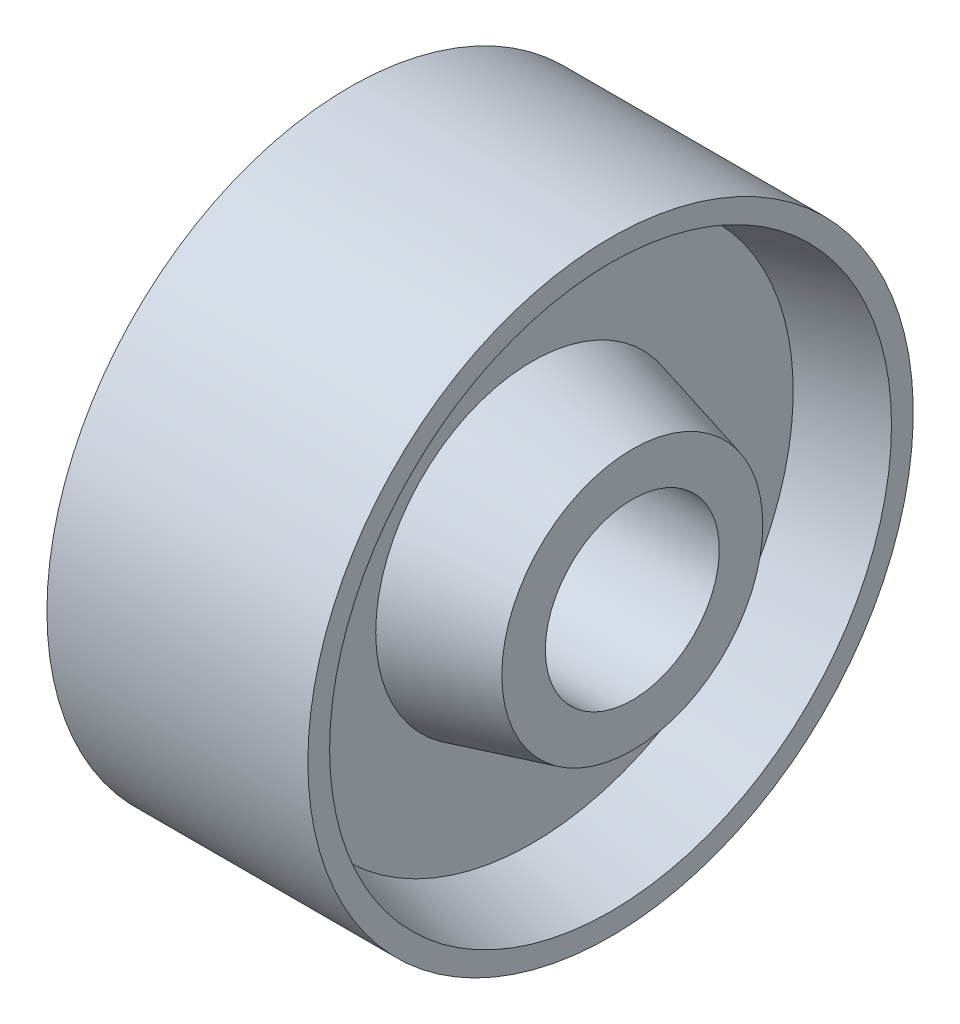
ISO-10303-21;
HEADER;
FILE_DESCRIPTION(('STEP AP214'),'2;1');
FILE_NAME('part.step','',(''),(''),'','','');
FILE_SCHEMA(('AUTOMOTIVE_DESIGN { 1 0 10303 214 1 1 1 1 }'));
ENDSEC;
DATA;
#1=APPLICATION_CONTEXT('core data for automotive mechanical design processes');
#2=APPLICATION_PROTOCOL_DEFINITION('international standard','automotive_design',2000,#1);
#3=PRODUCT_CONTEXT('',#1,'mechanical');
#4=PRODUCT('Part','Part','',(#3));
#5=PRODUCT_RELATED_PRODUCT_CATEGORY('part','',(#4));
#6=PRODUCT_DEFINITION_FORMATION('','',#4);
#7=PRODUCT_DEFINITION_CONTEXT('part definition',#1,'design');
#8=PRODUCT_DEFINITION('design','',#6,#7);
#9=PRODUCT_DEFINITION_SHAPE('','',#8);
#10=(LENGTH_UNIT() NAMED_UNIT(*) SI_UNIT(.MILLI.,.METRE.));
#11=(NAMED_UNIT(*) PLANE_ANGLE_UNIT() SI_UNIT($,.RADIAN.));
#12=(NAMED_UNIT(*) SI_UNIT($,.STERADIAN.) SOLID_ANGLE_UNIT());
#13=UNCERTAINTY_MEASURE_WITH_UNIT(LENGTH_MEASURE(1.E-05),#10,'distance_accuracy_value','');
#14=(GEOMETRIC_REPRESENTATION_CONTEXT(3) GLOBAL_UNCERTAINTY_ASSIGNED_CONTEXT((#13)) GLOBAL_UNIT_ASSIGNED_CONTEXT((#10,
#11,#12)) REPRESENTATION_CONTEXT('',''));
#15=CARTESIAN_POINT('',(0.,0.,0.));
#16=DIRECTION('',(0.,0.,1.));
#17=DIRECTION('',(1.,0.,0.));
#18=AXIS2_PLACEMENT_3D('',#15,#16,#17);
#19=CARTESIAN_POINT('',(-22.225,19.05,0.));
#20=DIRECTION('',(1.,0.,0.));
#21=DIRECTION('',(0.,0.,-1.));
#22=AXIS2_PLACEMENT_3D('',#19,#20,#21);
#23=PLANE('',#22);
#24=CARTESIAN_POINT('',(-22.225,0.,0.));
#25=DIRECTION('',(-1.,0.,0.));
#26=DIRECTION('',(0.,0.,1.));
#27=AXIS2_PLACEMENT_3D('',#24,#25,#26);
#28=CIRCLE('',#27,12.7);
#29=CARTESIAN_POINT('',(-22.225,0.,12.7));
#30=VERTEX_POINT('',#29);
#31=EDGE_CURVE('E10',#30,#30,#28,.T.);
#32=ORIENTED_EDGE('',*,*,#31,.F.);
#33=EDGE_LOOP('',(#32));
#34=FACE_BOUND('',#33,.T.);
#35=CARTESIAN_POINT('',(-22.225,0.,0.));
#36=DIRECTION('',(-1.,0.,0.));
#37=DIRECTION('',(0.,0.,1.));
#38=AXIS2_PLACEMENT_3D('',#35,#36,#37);
#39=CIRCLE('',#38,19.05);
#40=CARTESIAN_POINT('',(-22.225,0.,19.05));
#41=VERTEX_POINT('',#40);
#42=EDGE_CURVE('E92',#41,#41,#39,.T.);
#43=ORIENTED_EDGE('',*,*,#42,.T.);
#44=EDGE_LOOP('',(#43));
#45=FACE_BOUND('',#44,.T.);
#46=ADVANCED_FACE('F41',(#34,#45),#23,.F.);
#47=CARTESIAN_POINT('',(-95.5412844036698,0.,0.));
#48=DIRECTION('',(-1.,0.,0.));
#49=DIRECTION('',(0.,0.,1.));
#50=AXIS2_PLACEMENT_3D('',#47,#48,#49);
#51=CYLINDRICAL_SURFACE('',#50,12.7);
#52=CARTESIAN_POINT('',(22.225,0.,0.));
#53=DIRECTION('',(-1.,0.,0.));
#54=DIRECTION('',(0.,0.,1.));
#55=AXIS2_PLACEMENT_3D('',#52,#53,#54);
#56=CIRCLE('',#55,12.7);
#57=CARTESIAN_POINT('',(22.225,0.,12.7));
#58=VERTEX_POINT('',#57);
#59=EDGE_CURVE('E48',#58,#58,#56,.T.);
#60=ORIENTED_EDGE('',*,*,#59,.F.);
#61=EDGE_LOOP('',(#60));
#62=FACE_BOUND('',#61,.T.);
#63=ORIENTED_EDGE('',*,*,#31,.T.);
#64=EDGE_LOOP('',(#63));
#65=FACE_BOUND('',#64,.T.);
#66=ADVANCED_FACE('F154',(#62,#65),#51,.F.);
#67=CARTESIAN_POINT('',(22.225,12.7,0.));
#68=DIRECTION('',(-1.,0.,0.));
#69=DIRECTION('',(0.,0.,1.));
#70=AXIS2_PLACEMENT_3D('',#67,#68,#69);
#71=PLANE('',#70);
#72=CARTESIAN_POINT('',(22.225,0.,0.));
#73=DIRECTION('',(-1.,0.,0.));
#74=DIRECTION('',(0.,0.,1.));
#75=AXIS2_PLACEMENT_3D('',#72,#73,#74);
#76=CIRCLE('',#75,19.05);
#77=CARTESIAN_POINT('',(22.225,0.,19.05));
#78=VERTEX_POINT('',#77);
#79=EDGE_CURVE('E53',#78,#78,#76,.T.);
#80=ORIENTED_EDGE('',*,*,#79,.F.);
#81=EDGE_LOOP('',(#80));
#82=FACE_BOUND('',#81,.T.);
#83=ORIENTED_EDGE('',*,*,#59,.T.);
#84=EDGE_LOOP('',(#83));
#85=FACE_BOUND('',#84,.T.);
#86=ADVANCED_FACE('F149',(#82,#85),#71,.F.);
#87=CARTESIAN_POINT('',(22.225,0.,0.));
#88=DIRECTION('',(-1.,0.,0.));
#89=DIRECTION('',(0.,0.,1.));
#90=AXIS2_PLACEMENT_3D('',#87,#88,#89);
#91=CONICAL_SURFACE('',#90,19.05,0.255182390620818);
#92=CARTESIAN_POINT('',(7.62,0.,0.));
#93=DIRECTION('',(-1.,0.,0.));
#94=DIRECTION('',(0.,0.,1.));
#95=AXIS2_PLACEMENT_3D('',#92,#93,#94);
#96=CIRCLE('',#95,22.86);
#97=CARTESIAN_POINT('',(7.62,0.,22.86));
#98=VERTEX_POINT('',#97);
#99=EDGE_CURVE('E58',#98,#98,#96,.T.);
#100=ORIENTED_EDGE('',*,*,#99,.F.);
#101=EDGE_LOOP('',(#100));
#102=FACE_BOUND('',#101,.T.);
#103=ORIENTED_EDGE('',*,*,#79,.T.);
#104=EDGE_LOOP('',(#103));
#105=FACE_BOUND('',#104,.T.);
#106=ADVANCED_FACE('F143',(#102,#105),#91,.T.);
#107=CARTESIAN_POINT('',(7.62,22.86,0.));
#108=DIRECTION('',(-1.,0.,0.));
#109=DIRECTION('',(0.,0.,1.));
#110=AXIS2_PLACEMENT_3D('',#107,#108,#109);
#111=PLANE('',#110);
#112=CARTESIAN_POINT('',(7.62,0.,0.));
#113=DIRECTION('',(-1.,0.,0.));
#114=DIRECTION('',(0.,0.,1.));
#115=AXIS2_PLACEMENT_3D('',#112,#113,#114);
#116=CIRCLE('',#115,38.1);
#117=CARTESIAN_POINT('',(7.62,0.,38.1));
#118=VERTEX_POINT('',#117);
#119=EDGE_CURVE('E64',#118,#118,#116,.T.);
#120=ORIENTED_EDGE('',*,*,#119,.F.);
#121=EDGE_LOOP('',(#120));
#122=FACE_BOUND('',#121,.T.);
#123=ORIENTED_EDGE('',*,*,#99,.T.);
#124=EDGE_LOOP('',(#123));
#125=FACE_BOUND('',#124,.T.);
#126=ADVANCED_FACE('F137',(#122,#125),#111,.F.);
#127=CARTESIAN_POINT('',(7.62,0.,0.));
#128=DIRECTION('',(1.,0.,0.));
#129=DIRECTION('',(0.,0.,-1.));
#130=AXIS2_PLACEMENT_3D('',#127,#128,#129);
#131=CONICAL_SURFACE('',#130,38.1,0.250200547777641);
#132=CARTESIAN_POINT('',(19.05,0.,0.));
#133=DIRECTION('',(-1.,0.,0.));
#134=DIRECTION('',(0.,0.,1.));
#135=AXIS2_PLACEMENT_3D('',#132,#133,#134);
#136=CIRCLE('',#135,41.021);
#137=CARTESIAN_POINT('',(19.05,0.,41.021));
#138=VERTEX_POINT('',#137);
#139=EDGE_CURVE('E68',#138,#138,#136,.T.);
#140=ORIENTED_EDGE('',*,*,#139,.F.);
#141=EDGE_LOOP('',(#140));
#142=FACE_BOUND('',#141,.T.);
#143=ORIENTED_EDGE('',*,*,#119,.T.);
#144=EDGE_LOOP('',(#143));
#145=FACE_BOUND('',#144,.T.);
#146=ADVANCED_FACE('F131',(#142,#145),#131,.F.);
#147=CARTESIAN_POINT('',(19.05,41.021,0.));
#148=DIRECTION('',(-1.,0.,0.));
#149=DIRECTION('',(0.,0.,1.));
#150=AXIS2_PLACEMENT_3D('',#147,#148,#149);
#151=PLANE('',#150);
#152=CARTESIAN_POINT('',(19.05,0.,0.));
#153=DIRECTION('',(-1.,0.,0.));
#154=DIRECTION('',(0.,0.,1.));
#155=AXIS2_PLACEMENT_3D('',#152,#153,#154);
#156=CIRCLE('',#155,44.196);
#157=CARTESIAN_POINT('',(19.05,0.,44.196));
#158=VERTEX_POINT('',#157);
#159=EDGE_CURVE('E72',#158,#158,#156,.T.);
#160=ORIENTED_EDGE('',*,*,#159,.F.);
#161=EDGE_LOOP('',(#160));
#162=FACE_BOUND('',#161,.T.);
#163=ORIENTED_EDGE('',*,*,#139,.T.);
#164=EDGE_LOOP('',(#163));
#165=FACE_BOUND('',#164,.T.);
#166=ADVANCED_FACE('F125',(#162,#165),#151,.F.);
#167=CARTESIAN_POINT('',(-95.5412844036698,0.,0.));
#168=DIRECTION('',(-1.,0.,0.));
#169=DIRECTION('',(0.,0.,1.));
#170=AXIS2_PLACEMENT_3D('',#167,#168,#169);
#171=CYLINDRICAL_SURFACE('',#170,44.196);
#172=CARTESIAN_POINT('',(-19.05,0.,0.));
#173=DIRECTION('',(-1.,0.,0.));
#174=DIRECTION('',(0.,0.,1.));
#175=AXIS2_PLACEMENT_3D('',#172,#173,#174);
#176=CIRCLE('',#175,44.196);
#177=CARTESIAN_POINT('',(-19.05,0.,44.196));
#178=VERTEX_POINT('',#177);
#179=EDGE_CURVE('E76',#178,#178,#176,.T.);
#180=ORIENTED_EDGE('',*,*,#179,.F.);
#181=EDGE_LOOP('',(#180));
#182=FACE_BOUND('',#181,.T.);
#183=ORIENTED_EDGE('',*,*,#159,.T.);
#184=EDGE_LOOP('',(#183));
#185=FACE_BOUND('',#184,.T.);
#186=ADVANCED_FACE('F119',(#182,#185),#171,.T.);
#187=CARTESIAN_POINT('',(-19.05,44.196,0.));
#188=DIRECTION('',(1.,0.,0.));
#189=DIRECTION('',(0.,0.,-1.));
#190=AXIS2_PLACEMENT_3D('',#187,#188,#189);
#191=PLANE('',#190);
#192=CARTESIAN_POINT('',(-19.05,0.,0.));
#193=DIRECTION('',(-1.,0.,0.));
#194=DIRECTION('',(0.,0.,1.));
#195=AXIS2_PLACEMENT_3D('',#192,#193,#194);
#196=CIRCLE('',#195,41.021);
#197=CARTESIAN_POINT('',(-19.05,0.,41.021));
#198=VERTEX_POINT('',#197);
#199=EDGE_CURVE('E80',#198,#198,#196,.T.);
#200=ORIENTED_EDGE('',*,*,#199,.F.);
#201=EDGE_LOOP('',(#200));
#202=FACE_BOUND('',#201,.T.);
#203=ORIENTED_EDGE('',*,*,#179,.T.);
#204=EDGE_LOOP('',(#203));
#205=FACE_BOUND('',#204,.T.);
#206=ADVANCED_FACE('F113',(#202,#205),#191,.F.);
#207=CARTESIAN_POINT('',(-19.05,0.,0.));
#208=DIRECTION('',(-1.,0.,0.));
#209=DIRECTION('',(0.,0.,1.));
#210=AXIS2_PLACEMENT_3D('',#207,#208,#209);
#211=CONICAL_SURFACE('',#210,41.021,0.250200547777641);
#212=CARTESIAN_POINT('',(-7.62,0.,0.));
#213=DIRECTION('',(-1.,0.,0.));
#214=DIRECTION('',(0.,0.,1.));
#215=AXIS2_PLACEMENT_3D('',#212,#213,#214);
#216=CIRCLE('',#215,38.1);
#217=CARTESIAN_POINT('',(-7.62,0.,38.1));
#218=VERTEX_POINT('',#217);
#219=EDGE_CURVE('E84',#218,#218,#216,.T.);
#220=ORIENTED_EDGE('',*,*,#219,.F.);
#221=EDGE_LOOP('',(#220));
#222=FACE_BOUND('',#221,.T.);
#223=ORIENTED_EDGE('',*,*,#199,.T.);
#224=EDGE_LOOP('',(#223));
#225=FACE_BOUND('',#224,.T.);
#226=ADVANCED_FACE('F107',(#222,#225),#211,.F.);
#227=CARTESIAN_POINT('',(-7.62,38.1,0.));
#228=DIRECTION('',(1.,0.,0.));
#229=DIRECTION('',(0.,0.,-1.));
#230=AXIS2_PLACEMENT_3D('',#227,#228,#229);
#231=PLANE('',#230);
#232=CARTESIAN_POINT('',(-7.62,0.,0.));
#233=DIRECTION('',(-1.,0.,0.));
#234=DIRECTION('',(0.,0.,1.));
#235=AXIS2_PLACEMENT_3D('',#232,#233,#234);
#236=CIRCLE('',#235,22.86);
#237=CARTESIAN_POINT('',(-7.62,0.,22.86));
#238=VERTEX_POINT('',#237);
#239=EDGE_CURVE('E88',#238,#238,#236,.T.);
#240=ORIENTED_EDGE('',*,*,#239,.F.);
#241=EDGE_LOOP('',(#240));
#242=FACE_BOUND('',#241,.T.);
#243=ORIENTED_EDGE('',*,*,#219,.T.);
#244=EDGE_LOOP('',(#243));
#245=FACE_BOUND('',#244,.T.);
#246=ADVANCED_FACE('F101',(#242,#245),#231,.F.);
#247=CARTESIAN_POINT('',(-7.62,0.,0.));
#248=DIRECTION('',(1.,0.,0.));
#249=DIRECTION('',(0.,0.,-1.));
#250=AXIS2_PLACEMENT_3D('',#247,#248,#249);
#251=CONICAL_SURFACE('',#250,22.86,0.255182390620818);
#252=ORIENTED_EDGE('',*,*,#42,.F.);
#253=EDGE_LOOP('',(#252));
#254=FACE_BOUND('',#253,.T.);
#255=ORIENTED_EDGE('',*,*,#239,.T.);
#256=EDGE_LOOP('',(#255));
#257=FACE_BOUND('',#256,.T.);
#258=ADVANCED_FACE('F98',(#254,#257),#251,.T.);
#259=CLOSED_SHELL('',(#46,#66,#86,#106,#126,#146,#166,#186,#206,#226,#246,#258));
#260=MANIFOLD_SOLID_BREP('B2',#259);
#261=ADVANCED_BREP_SHAPE_REPRESENTATION('',(#18,#260),#14);
#262=SHAPE_DEFINITION_REPRESENTATION(#9,#261);
ENDSEC;
END-ISO-10303-21;
